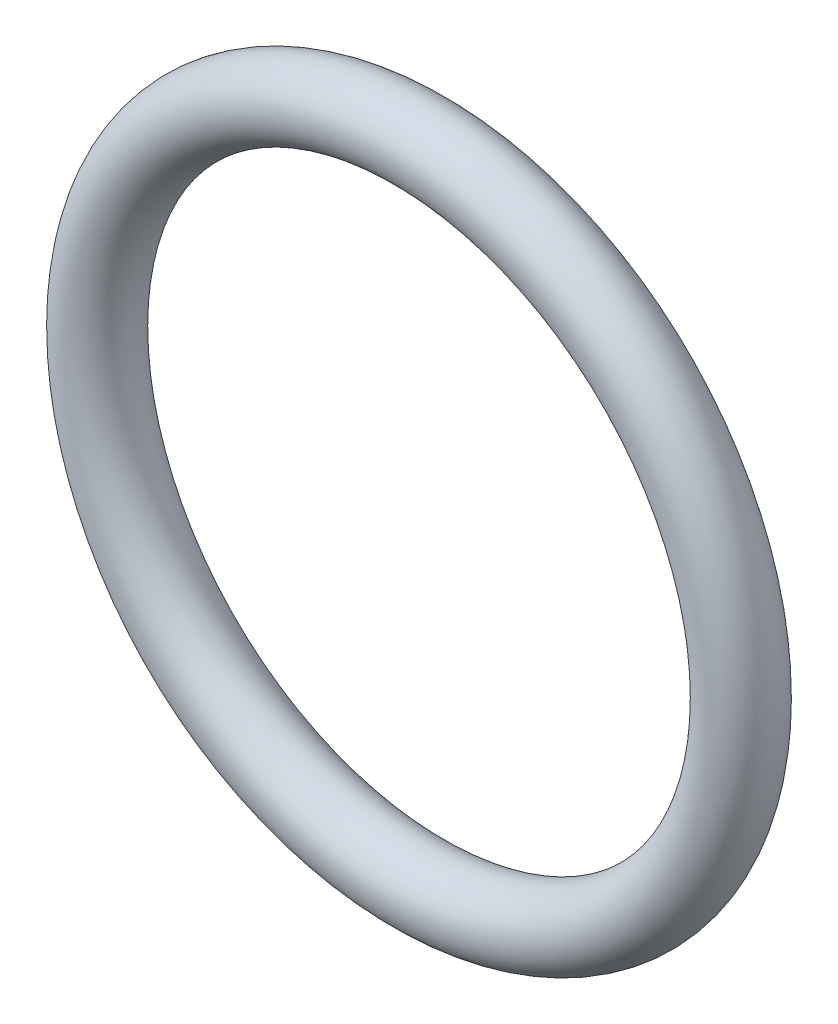
ISO-10303-21;
HEADER;
FILE_DESCRIPTION(('STEP AP214'),'2;1');
FILE_NAME('part.step','',(''),(''),'','','');
FILE_SCHEMA(('AUTOMOTIVE_DESIGN { 1 0 10303 214 1 1 1 1 }'));
ENDSEC;
DATA;
#1=APPLICATION_CONTEXT('core data for automotive mechanical design processes');
#2=APPLICATION_PROTOCOL_DEFINITION('international standard','automotive_design',2000,#1);
#3=PRODUCT_CONTEXT('',#1,'mechanical');
#4=PRODUCT('Part','Part','',(#3));
#5=PRODUCT_RELATED_PRODUCT_CATEGORY('part','',(#4));
#6=PRODUCT_DEFINITION_FORMATION('','',#4);
#7=PRODUCT_DEFINITION_CONTEXT('part definition',#1,'design');
#8=PRODUCT_DEFINITION('design','',#6,#7);
#9=PRODUCT_DEFINITION_SHAPE('','',#8);
#10=(LENGTH_UNIT() NAMED_UNIT(*) SI_UNIT(.MILLI.,.METRE.));
#11=(NAMED_UNIT(*) PLANE_ANGLE_UNIT() SI_UNIT($,.RADIAN.));
#12=(NAMED_UNIT(*) SI_UNIT($,.STERADIAN.) SOLID_ANGLE_UNIT());
#13=UNCERTAINTY_MEASURE_WITH_UNIT(LENGTH_MEASURE(1.E-05),#10,'distance_accuracy_value','');
#14=(GEOMETRIC_REPRESENTATION_CONTEXT(3) GLOBAL_UNCERTAINTY_ASSIGNED_CONTEXT((#13)) GLOBAL_UNIT_ASSIGNED_CONTEXT((#10,
#11,#12)) REPRESENTATION_CONTEXT('',''));
#15=CARTESIAN_POINT('',(0.,0.,0.));
#16=DIRECTION('',(0.,0.,1.));
#17=DIRECTION('',(1.,0.,0.));
#18=AXIS2_PLACEMENT_3D('',#15,#16,#17);
#19=CARTESIAN_POINT('',(0.,0.,0.));
#20=DIRECTION('',(0.,0.,1.));
#21=DIRECTION('',(1.,0.,0.));
#22=AXIS2_PLACEMENT_3D('',#19,#20,#21);
#23=TOROIDAL_SURFACE('',#22,15.75,1.75);
#24=CARTESIAN_POINT('',(17.5,0.,0.));
#25=VERTEX_POINT('',#24);
#26=VERTEX_LOOP('',#25);
#27=FACE_BOUND('',#26,.T.);
#28=ADVANCED_FACE('F28',(#27),#23,.T.);
#29=CLOSED_SHELL('',(#28));
#30=MANIFOLD_SOLID_BREP('B2',#29);
#31=ADVANCED_BREP_SHAPE_REPRESENTATION('',(#18,#30),#14);
#32=SHAPE_DEFINITION_REPRESENTATION(#9,#31);
ENDSEC;
END-ISO-10303-21;
